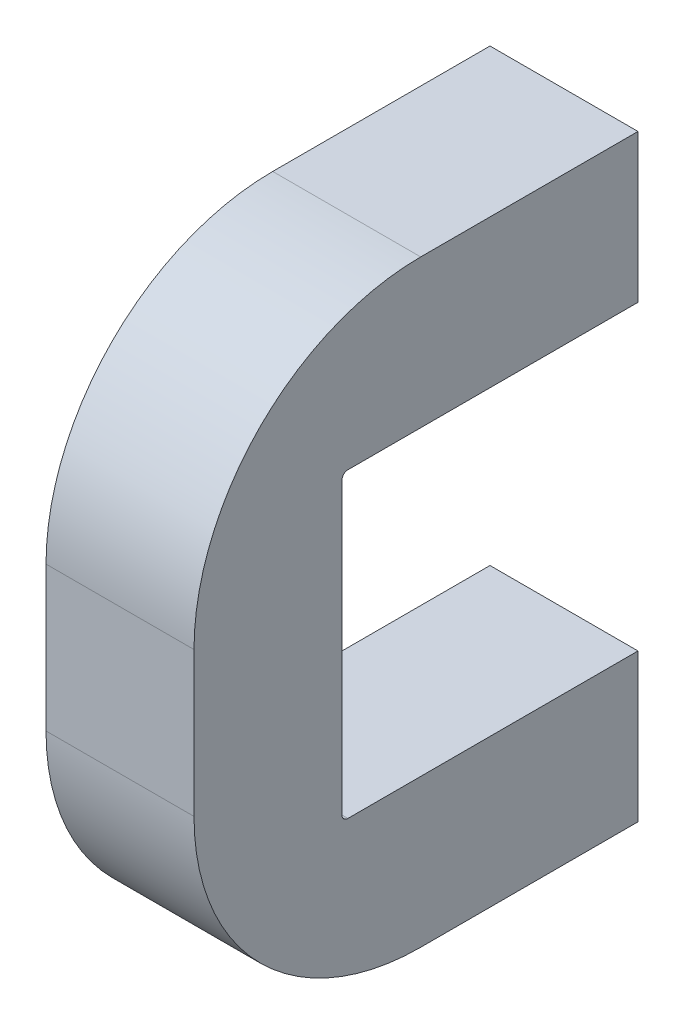
ISO-10303-21;
HEADER;
FILE_DESCRIPTION(('STEP AP214'),'2;1');
FILE_NAME('part.step','',(''),(''),'','','');
FILE_SCHEMA(('AUTOMOTIVE_DESIGN { 1 0 10303 214 1 1 1 1 }'));
ENDSEC;
DATA;
#1=APPLICATION_CONTEXT('core data for automotive mechanical design processes');
#2=APPLICATION_PROTOCOL_DEFINITION('international standard','automotive_design',2000,#1);
#3=PRODUCT_CONTEXT('',#1,'mechanical');
#4=PRODUCT('Part','Part','',(#3));
#5=PRODUCT_RELATED_PRODUCT_CATEGORY('part','',(#4));
#6=PRODUCT_DEFINITION_FORMATION('','',#4);
#7=PRODUCT_DEFINITION_CONTEXT('part definition',#1,'design');
#8=PRODUCT_DEFINITION('design','',#6,#7);
#9=PRODUCT_DEFINITION_SHAPE('','',#8);
#10=(LENGTH_UNIT() NAMED_UNIT(*) SI_UNIT(.MILLI.,.METRE.));
#11=(NAMED_UNIT(*) PLANE_ANGLE_UNIT() SI_UNIT($,.RADIAN.));
#12=(NAMED_UNIT(*) SI_UNIT($,.STERADIAN.) SOLID_ANGLE_UNIT());
#13=UNCERTAINTY_MEASURE_WITH_UNIT(LENGTH_MEASURE(1.E-05),#10,'distance_accuracy_value','');
#14=(GEOMETRIC_REPRESENTATION_CONTEXT(3) GLOBAL_UNCERTAINTY_ASSIGNED_CONTEXT((#13)) GLOBAL_UNIT_ASSIGNED_CONTEXT((#10,
#11,#12)) REPRESENTATION_CONTEXT('',''));
#15=CARTESIAN_POINT('',(0.,0.,0.));
#16=DIRECTION('',(0.,0.,1.));
#17=DIRECTION('',(1.,0.,0.));
#18=AXIS2_PLACEMENT_3D('',#15,#16,#17);
#19=CARTESIAN_POINT('',(7.47463987678536,0.,-95.6657569939596));
#20=DIRECTION('',(0.,0.,-1.));
#21=DIRECTION('',(-1.,0.,0.));
#22=AXIS2_PLACEMENT_3D('',#19,#20,#21);
#23=PLANE('',#22);
#24=DIRECTION('',(0.,-1.,0.));
#25=VECTOR('',#24,1.);
#26=CARTESIAN_POINT('',(-2.52536012321464,0.,-95.6657569939596));
#27=LINE('',#26,#25);
#28=CARTESIAN_POINT('',(-2.52536012321464,170.453924473794,-95.6657569939596));
#29=VERTEX_POINT('',#28);
#30=CARTESIAN_POINT('',(-2.52536012321464,160.688239048845,-95.6657569939596));
#31=VERTEX_POINT('',#30);
#32=EDGE_CURVE('E236',#29,#31,#27,.T.);
#33=ORIENTED_EDGE('',*,*,#32,.T.);
#34=DIRECTION('',(-1.,0.,0.));
#35=VECTOR('',#34,1.);
#36=CARTESIAN_POINT('',(7.47463987678536,160.688239048845,-95.6657569939596));
#37=LINE('',#36,#35);
#38=CARTESIAN_POINT('',(7.47463987678536,160.688239048845,-95.6657569939596));
#39=VERTEX_POINT('',#38);
#40=EDGE_CURVE('E216',#39,#31,#37,.T.);
#41=ORIENTED_EDGE('',*,*,#40,.F.);
#42=DIRECTION('',(0.,-1.,0.));
#43=VECTOR('',#42,1.);
#44=CARTESIAN_POINT('',(7.47463987678536,0.,-95.6657569939596));
#45=LINE('',#44,#43);
#46=CARTESIAN_POINT('',(7.47463987678536,170.453924473794,-95.6657569939596));
#47=VERTEX_POINT('',#46);
#48=EDGE_CURVE('E223',#47,#39,#45,.T.);
#49=ORIENTED_EDGE('',*,*,#48,.F.);
#50=DIRECTION('',(-1.,0.,0.));
#51=VECTOR('',#50,1.);
#52=CARTESIAN_POINT('',(7.47463987678536,170.453924473794,-95.6657569939596));
#53=LINE('',#52,#51);
#54=EDGE_CURVE('E368',#47,#29,#53,.T.);
#55=ORIENTED_EDGE('',*,*,#54,.T.);
#56=EDGE_LOOP('',(#33,#41,#49,#55));
#57=FACE_BOUND('',#56,.T.);
#58=ADVANCED_FACE('F75',(#57),#23,.F.);
#59=CARTESIAN_POINT('',(7.47463987678536,160.688239048845,-110.982914281485));
#60=DIRECTION('',(-1.,0.,0.));
#61=DIRECTION('',(0.,0.,1.));
#62=AXIS2_PLACEMENT_3D('',#59,#60,#61);
#63=CYLINDRICAL_SURFACE('',#62,15.3171572875254);
#64=CARTESIAN_POINT('',(-2.52536012321464,160.688239048845,-110.982914281485));
#65=DIRECTION('',(1.,0.,0.));
#66=DIRECTION('',(0.,0.,-1.));
#67=AXIS2_PLACEMENT_3D('',#64,#65,#66);
#68=CIRCLE('',#67,15.3171572875254);
#69=CARTESIAN_POINT('',(-2.52536012321464,145.37108176132,-110.982914281485));
#70=VERTEX_POINT('',#69);
#71=EDGE_CURVE('E342',#31,#70,#68,.T.);
#72=ORIENTED_EDGE('',*,*,#71,.T.);
#73=DIRECTION('',(-1.,0.,0.));
#74=VECTOR('',#73,1.);
#75=CARTESIAN_POINT('',(7.47463987678536,145.37108176132,-110.982914281485));
#76=LINE('',#75,#74);
#77=CARTESIAN_POINT('',(7.47463987678536,145.37108176132,-110.982914281485));
#78=VERTEX_POINT('',#77);
#79=EDGE_CURVE('E219',#78,#70,#76,.T.);
#80=ORIENTED_EDGE('',*,*,#79,.F.);
#81=CARTESIAN_POINT('',(7.47463987678536,160.688239048845,-110.982914281485));
#82=DIRECTION('',(1.,0.,0.));
#83=DIRECTION('',(0.,0.,-1.));
#84=AXIS2_PLACEMENT_3D('',#81,#82,#83);
#85=CIRCLE('',#84,15.3171572875254);
#86=EDGE_CURVE('E212',#39,#78,#85,.T.);
#87=ORIENTED_EDGE('',*,*,#86,.F.);
#88=ORIENTED_EDGE('',*,*,#40,.T.);
#89=EDGE_LOOP('',(#72,#80,#87,#88));
#90=FACE_BOUND('',#89,.T.);
#91=ADVANCED_FACE('F214',(#90),#63,.T.);
#92=CARTESIAN_POINT('',(7.47463987678536,145.37108176132,0.));
#93=DIRECTION('',(0.,1.,0.));
#94=DIRECTION('',(0.,0.,1.));
#95=AXIS2_PLACEMENT_3D('',#92,#93,#94);
#96=PLANE('',#95);
#97=DIRECTION('',(0.,0.,-1.));
#98=VECTOR('',#97,1.);
#99=CARTESIAN_POINT('',(-2.52536012321464,145.37108176132,0.));
#100=LINE('',#99,#98);
#101=CARTESIAN_POINT('',(-2.52536012321464,145.37108176132,-125.66575699396));
#102=VERTEX_POINT('',#101);
#103=EDGE_CURVE('E371',#70,#102,#100,.T.);
#104=ORIENTED_EDGE('',*,*,#103,.T.);
#105=DIRECTION('',(-1.,0.,0.));
#106=VECTOR('',#105,1.);
#107=CARTESIAN_POINT('',(7.47463987678536,145.37108176132,-125.66575699396));
#108=LINE('',#107,#106);
#109=CARTESIAN_POINT('',(7.47463987678536,145.37108176132,-125.66575699396));
#110=VERTEX_POINT('',#109);
#111=EDGE_CURVE('E242',#110,#102,#108,.T.);
#112=ORIENTED_EDGE('',*,*,#111,.F.);
#113=DIRECTION('',(0.,0.,-1.));
#114=VECTOR('',#113,1.);
#115=CARTESIAN_POINT('',(7.47463987678536,145.37108176132,0.));
#116=LINE('',#115,#114);
#117=EDGE_CURVE('E222',#78,#110,#116,.T.);
#118=ORIENTED_EDGE('',*,*,#117,.F.);
#119=ORIENTED_EDGE('',*,*,#79,.T.);
#120=EDGE_LOOP('',(#104,#112,#118,#119));
#121=FACE_BOUND('',#120,.T.);
#122=ADVANCED_FACE('F314',(#121),#96,.F.);
#123=CARTESIAN_POINT('',(7.47463987678536,0.,-125.66575699396));
#124=DIRECTION('',(0.,0.,-1.));
#125=DIRECTION('',(-1.,0.,0.));
#126=AXIS2_PLACEMENT_3D('',#123,#124,#125);
#127=PLANE('',#126);
#128=CARTESIAN_POINT('',(5.57463987678536,150.37108176132,-125.66575699396));
#129=DIRECTION('',(0.,0.,-1.));
#130=DIRECTION('',(-1.,0.,0.));
#131=AXIS2_PLACEMENT_3D('',#128,#129,#130);
#132=CIRCLE('',#131,1.25);
#133=CARTESIAN_POINT('',(5.86697858646277,151.586416315599,-125.66575699396));
#134=VERTEX_POINT('',#133);
#135=CARTESIAN_POINT('',(5.86697858646277,149.155747207041,-125.66575699396));
#136=VERTEX_POINT('',#135);
#137=EDGE_CURVE('E248',#134,#136,#132,.T.);
#138=ORIENTED_EDGE('',*,*,#137,.F.);
#139=CARTESIAN_POINT('',(6.21778503807566,153.044817780733,-125.66575699396));
#140=DIRECTION('',(0.,0.,-1.));
#141=DIRECTION('',(-1.,0.,0.));
#142=AXIS2_PLACEMENT_3D('',#139,#140,#141);
#143=CIRCLE('',#142,1.5);
#144=CARTESIAN_POINT('',(4.99719422461143,152.17294733962,-125.66575699396));
#145=VERTEX_POINT('',#144);
#146=EDGE_CURVE('E274',#134,#145,#143,.T.);
#147=ORIENTED_EDGE('',*,*,#146,.T.);
#148=CARTESIAN_POINT('',(2.47463987678536,150.37108176132,-125.66575699396));
#149=DIRECTION('',(0.,0.,-1.));
#150=DIRECTION('',(-1.,0.,0.));
#151=AXIS2_PLACEMENT_3D('',#148,#149,#150);
#152=CIRCLE('',#151,3.09999999999999);
#153=CARTESIAN_POINT('',(4.99719422461143,148.569216183019,-125.66575699396));
#154=VERTEX_POINT('',#153);
#155=EDGE_CURVE('E251',#154,#145,#152,.T.);
#156=ORIENTED_EDGE('',*,*,#155,.F.);
#157=CARTESIAN_POINT('',(6.21778503807566,147.697345741906,-125.66575699396));
#158=DIRECTION('',(0.,0.,-1.));
#159=DIRECTION('',(-1.,0.,0.));
#160=AXIS2_PLACEMENT_3D('',#157,#158,#159);
#161=CIRCLE('',#160,1.5);
#162=EDGE_CURVE('E272',#154,#136,#161,.T.);
#163=ORIENTED_EDGE('',*,*,#162,.T.);
#164=EDGE_LOOP('',(#138,#147,#156,#163));
#165=FACE_BOUND('',#164,.T.);
#166=DIRECTION('',(0.,-1.,0.));
#167=VECTOR('',#166,1.);
#168=CARTESIAN_POINT('',(-2.52536012321464,0.,-125.66575699396));
#169=LINE('',#168,#167);
#170=CARTESIAN_POINT('',(-2.52536012321464,155.37108176132,-125.66575699396));
#171=VERTEX_POINT('',#170);
#172=EDGE_CURVE('E374',#171,#102,#169,.T.);
#173=ORIENTED_EDGE('',*,*,#172,.F.);
#174=DIRECTION('',(-1.,0.,0.));
#175=VECTOR('',#174,1.);
#176=CARTESIAN_POINT('',(7.47463987678536,155.37108176132,-125.66575699396));
#177=LINE('',#176,#175);
#178=CARTESIAN_POINT('',(7.47463987678536,155.37108176132,-125.66575699396));
#179=VERTEX_POINT('',#178);
#180=EDGE_CURVE('E414',#179,#171,#177,.T.);
#181=ORIENTED_EDGE('',*,*,#180,.F.);
#182=DIRECTION('',(0.,-1.,0.));
#183=VECTOR('',#182,1.);
#184=CARTESIAN_POINT('',(7.47463987678536,0.,-125.66575699396));
#185=LINE('',#184,#183);
#186=EDGE_CURVE('E348',#179,#110,#185,.T.);
#187=ORIENTED_EDGE('',*,*,#186,.T.);
#188=ORIENTED_EDGE('',*,*,#111,.T.);
#189=EDGE_LOOP('',(#173,#181,#187,#188));
#190=FACE_BOUND('',#189,.T.);
#191=ADVANCED_FACE('F299',(#165,#190),#127,.T.);
#192=CARTESIAN_POINT('',(7.47463987678536,155.37108176132,0.));
#193=DIRECTION('',(0.,-1.,0.));
#194=DIRECTION('',(0.,0.,-1.));
#195=AXIS2_PLACEMENT_3D('',#192,#193,#194);
#196=PLANE('',#195);
#197=DIRECTION('',(0.,0.,1.));
#198=VECTOR('',#197,1.);
#199=CARTESIAN_POINT('',(-2.52536012321464,155.37108176132,0.));
#200=LINE('',#199,#198);
#201=CARTESIAN_POINT('',(-2.52536012321464,155.37108176132,-106.06575699396));
#202=VERTEX_POINT('',#201);
#203=EDGE_CURVE('E377',#171,#202,#200,.T.);
#204=ORIENTED_EDGE('',*,*,#203,.T.);
#205=DIRECTION('',(-1.,0.,0.));
#206=VECTOR('',#205,1.);
#207=CARTESIAN_POINT('',(7.47463987678536,155.37108176132,-106.06575699396));
#208=LINE('',#207,#206);
#209=CARTESIAN_POINT('',(7.47463987678536,155.37108176132,-106.06575699396));
#210=VERTEX_POINT('',#209);
#211=EDGE_CURVE('E412',#210,#202,#208,.T.);
#212=ORIENTED_EDGE('',*,*,#211,.F.);
#213=DIRECTION('',(0.,0.,1.));
#214=VECTOR('',#213,1.);
#215=CARTESIAN_POINT('',(7.47463987678536,155.37108176132,0.));
#216=LINE('',#215,#214);
#217=EDGE_CURVE('E351',#179,#210,#216,.T.);
#218=ORIENTED_EDGE('',*,*,#217,.F.);
#219=ORIENTED_EDGE('',*,*,#180,.T.);
#220=EDGE_LOOP('',(#204,#212,#218,#219));
#221=FACE_BOUND('',#220,.T.);
#222=ADVANCED_FACE('F427',(#221),#196,.F.);
#223=CARTESIAN_POINT('',(7.47463987678536,155.77108176132,-106.06575699396));
#224=DIRECTION('',(-1.,0.,0.));
#225=DIRECTION('',(0.,0.,1.));
#226=AXIS2_PLACEMENT_3D('',#223,#224,#225);
#227=CYLINDRICAL_SURFACE('',#226,0.399999999999998);
#228=CARTESIAN_POINT('',(-2.52536012321464,155.77108176132,-106.06575699396));
#229=DIRECTION('',(1.,0.,0.));
#230=DIRECTION('',(0.,0.,-1.));
#231=AXIS2_PLACEMENT_3D('',#228,#229,#230);
#232=CIRCLE('',#231,0.399999999999998);
#233=CARTESIAN_POINT('',(-2.52536012321464,155.77108176132,-105.66575699396));
#234=VERTEX_POINT('',#233);
#235=EDGE_CURVE('E380',#234,#202,#232,.T.);
#236=ORIENTED_EDGE('',*,*,#235,.F.);
#237=DIRECTION('',(-1.,0.,0.));
#238=VECTOR('',#237,1.);
#239=CARTESIAN_POINT('',(7.47463987678536,155.77108176132,-105.66575699396));
#240=LINE('',#239,#238);
#241=CARTESIAN_POINT('',(7.47463987678536,155.77108176132,-105.66575699396));
#242=VERTEX_POINT('',#241);
#243=EDGE_CURVE('E410',#242,#234,#240,.T.);
#244=ORIENTED_EDGE('',*,*,#243,.F.);
#245=CARTESIAN_POINT('',(7.47463987678536,155.77108176132,-106.06575699396));
#246=DIRECTION('',(1.,0.,0.));
#247=DIRECTION('',(0.,0.,-1.));
#248=AXIS2_PLACEMENT_3D('',#245,#246,#247);
#249=CIRCLE('',#248,0.399999999999998);
#250=EDGE_CURVE('E353',#242,#210,#249,.T.);
#251=ORIENTED_EDGE('',*,*,#250,.T.);
#252=ORIENTED_EDGE('',*,*,#211,.T.);
#253=EDGE_LOOP('',(#236,#244,#251,#252));
#254=FACE_BOUND('',#253,.T.);
#255=ADVANCED_FACE('F434',(#254),#227,.F.);
#256=CARTESIAN_POINT('',(7.47463987678536,2.98222503037371E-13,-105.66575699396));
#257=DIRECTION('',(0.,0.,1.));
#258=DIRECTION('',(0.,-1.,0.));
#259=AXIS2_PLACEMENT_3D('',#256,#257,#258);
#260=PLANE('',#259);
#261=DIRECTION('',(0.,1.,0.));
#262=VECTOR('',#261,1.);
#263=CARTESIAN_POINT('',(-2.52536012321464,2.98222503037371E-13,-105.66575699396));
#264=LINE('',#263,#262);
#265=CARTESIAN_POINT('',(-2.52536012321464,175.37108176132,-105.66575699396));
#266=VERTEX_POINT('',#265);
#267=EDGE_CURVE('E383',#234,#266,#264,.T.);
#268=ORIENTED_EDGE('',*,*,#267,.T.);
#269=DIRECTION('',(-1.,0.,0.));
#270=VECTOR('',#269,1.);
#271=CARTESIAN_POINT('',(7.47463987678536,175.37108176132,-105.66575699396));
#272=LINE('',#271,#270);
#273=CARTESIAN_POINT('',(7.47463987678536,175.37108176132,-105.66575699396));
#274=VERTEX_POINT('',#273);
#275=EDGE_CURVE('E408',#274,#266,#272,.T.);
#276=ORIENTED_EDGE('',*,*,#275,.F.);
#277=DIRECTION('',(0.,1.,0.));
#278=VECTOR('',#277,1.);
#279=CARTESIAN_POINT('',(7.47463987678536,2.98222503037371E-13,-105.66575699396));
#280=LINE('',#279,#278);
#281=EDGE_CURVE('E356',#242,#274,#280,.T.);
#282=ORIENTED_EDGE('',*,*,#281,.F.);
#283=ORIENTED_EDGE('',*,*,#243,.T.);
#284=EDGE_LOOP('',(#268,#276,#282,#283));
#285=FACE_BOUND('',#284,.T.);
#286=ADVANCED_FACE('F436',(#285),#260,.F.);
#287=CARTESIAN_POINT('',(7.47463987678536,175.37108176132,-106.06575699396));
#288=DIRECTION('',(-1.,0.,0.));
#289=DIRECTION('',(0.,0.,1.));
#290=AXIS2_PLACEMENT_3D('',#287,#288,#289);
#291=CYLINDRICAL_SURFACE('',#290,0.400000000000005);
#292=CARTESIAN_POINT('',(-2.52536012321464,175.37108176132,-106.06575699396));
#293=DIRECTION('',(1.,0.,0.));
#294=DIRECTION('',(0.,0.,-1.));
#295=AXIS2_PLACEMENT_3D('',#292,#293,#294);
#296=CIRCLE('',#295,0.400000000000005);
#297=CARTESIAN_POINT('',(-2.52536012321464,175.77108176132,-106.06575699396));
#298=VERTEX_POINT('',#297);
#299=EDGE_CURVE('E386',#298,#266,#296,.T.);
#300=ORIENTED_EDGE('',*,*,#299,.F.);
#301=DIRECTION('',(-1.,0.,0.));
#302=VECTOR('',#301,1.);
#303=CARTESIAN_POINT('',(7.47463987678536,175.77108176132,-106.06575699396));
#304=LINE('',#303,#302);
#305=CARTESIAN_POINT('',(7.47463987678536,175.77108176132,-106.06575699396));
#306=VERTEX_POINT('',#305);
#307=EDGE_CURVE('E406',#306,#298,#304,.T.);
#308=ORIENTED_EDGE('',*,*,#307,.F.);
#309=CARTESIAN_POINT('',(7.47463987678536,175.37108176132,-106.06575699396));
#310=DIRECTION('',(1.,0.,0.));
#311=DIRECTION('',(0.,0.,-1.));
#312=AXIS2_PLACEMENT_3D('',#309,#310,#311);
#313=CIRCLE('',#312,0.400000000000005);
#314=EDGE_CURVE('E358',#306,#274,#313,.T.);
#315=ORIENTED_EDGE('',*,*,#314,.T.);
#316=ORIENTED_EDGE('',*,*,#275,.T.);
#317=EDGE_LOOP('',(#300,#308,#315,#316));
#318=FACE_BOUND('',#317,.T.);
#319=ADVANCED_FACE('F439',(#318),#291,.F.);
#320=CARTESIAN_POINT('',(7.47463987678536,175.771081761321,-1.98432845060461E-12));
#321=DIRECTION('',(0.,1.,0.));
#322=DIRECTION('',(0.,0.,1.));
#323=AXIS2_PLACEMENT_3D('',#320,#321,#322);
#324=PLANE('',#323);
#325=DIRECTION('',(0.,0.,-1.));
#326=VECTOR('',#325,1.);
#327=CARTESIAN_POINT('',(-2.52536012321464,175.771081761321,-1.98432845060461E-12));
#328=LINE('',#327,#326);
#329=CARTESIAN_POINT('',(-2.52536012321464,175.77108176132,-125.66575699396));
#330=VERTEX_POINT('',#329);
#331=EDGE_CURVE('E389',#298,#330,#328,.T.);
#332=ORIENTED_EDGE('',*,*,#331,.T.);
#333=DIRECTION('',(-1.,0.,0.));
#334=VECTOR('',#333,1.);
#335=CARTESIAN_POINT('',(7.47463987678536,175.77108176132,-125.66575699396));
#336=LINE('',#335,#334);
#337=CARTESIAN_POINT('',(7.47463987678536,175.77108176132,-125.66575699396));
#338=VERTEX_POINT('',#337);
#339=EDGE_CURVE('E403',#338,#330,#336,.T.);
#340=ORIENTED_EDGE('',*,*,#339,.F.);
#341=DIRECTION('',(0.,0.,-1.));
#342=VECTOR('',#341,1.);
#343=CARTESIAN_POINT('',(7.47463987678536,175.771081761321,-1.98432845060461E-12));
#344=LINE('',#343,#342);
#345=EDGE_CURVE('E361',#306,#338,#344,.T.);
#346=ORIENTED_EDGE('',*,*,#345,.F.);
#347=ORIENTED_EDGE('',*,*,#307,.T.);
#348=EDGE_LOOP('',(#332,#340,#346,#347));
#349=FACE_BOUND('',#348,.T.);
#350=ADVANCED_FACE('F445',(#349),#324,.F.);
#351=CARTESIAN_POINT('',(7.47463987678536,0.,-125.66575699396));
#352=DIRECTION('',(0.,0.,1.));
#353=DIRECTION('',(1.,0.,0.));
#354=AXIS2_PLACEMENT_3D('',#351,#352,#353);
#355=PLANE('',#354);
#356=CARTESIAN_POINT('',(5.57463987678536,180.77108176132,-125.66575699396));
#357=DIRECTION('',(0.,0.,1.));
#358=DIRECTION('',(1.,0.,0.));
#359=AXIS2_PLACEMENT_3D('',#356,#357,#358);
#360=CIRCLE('',#359,1.25);
#361=CARTESIAN_POINT('',(5.86697858646277,179.555747207041,-125.66575699396));
#362=VERTEX_POINT('',#361);
#363=CARTESIAN_POINT('',(5.86697858646277,181.986416315599,-125.66575699396));
#364=VERTEX_POINT('',#363);
#365=EDGE_CURVE('E240',#362,#364,#360,.T.);
#366=ORIENTED_EDGE('',*,*,#365,.T.);
#367=CARTESIAN_POINT('',(6.21778503807566,183.444817780733,-125.66575699396));
#368=DIRECTION('',(0.,0.,1.));
#369=DIRECTION('',(1.,0.,0.));
#370=AXIS2_PLACEMENT_3D('',#367,#368,#369);
#371=CIRCLE('',#370,1.5);
#372=CARTESIAN_POINT('',(4.99719422461142,182.57294733962,-125.66575699396));
#373=VERTEX_POINT('',#372);
#374=EDGE_CURVE('E260',#364,#373,#371,.F.);
#375=ORIENTED_EDGE('',*,*,#374,.T.);
#376=CARTESIAN_POINT('',(2.47463987678536,180.77108176132,-125.66575699396));
#377=DIRECTION('',(0.,0.,1.));
#378=DIRECTION('',(1.,0.,0.));
#379=AXIS2_PLACEMENT_3D('',#376,#377,#378);
#380=CIRCLE('',#379,3.09999999999998);
#381=CARTESIAN_POINT('',(4.99719422461142,178.969216183019,-125.66575699396));
#382=VERTEX_POINT('',#381);
#383=EDGE_CURVE('E237',#373,#382,#380,.T.);
#384=ORIENTED_EDGE('',*,*,#383,.T.);
#385=CARTESIAN_POINT('',(6.21778503807566,178.097345741906,-125.66575699396));
#386=DIRECTION('',(0.,0.,1.));
#387=DIRECTION('',(1.,0.,0.));
#388=AXIS2_PLACEMENT_3D('',#385,#386,#387);
#389=CIRCLE('',#388,1.5);
#390=EDGE_CURVE('E258',#382,#362,#389,.F.);
#391=ORIENTED_EDGE('',*,*,#390,.T.);
#392=EDGE_LOOP('',(#366,#375,#384,#391));
#393=FACE_BOUND('',#392,.T.);
#394=DIRECTION('',(0.,1.,0.));
#395=VECTOR('',#394,1.);
#396=CARTESIAN_POINT('',(-2.52536012321464,0.,-125.66575699396));
#397=LINE('',#396,#395);
#398=CARTESIAN_POINT('',(-2.52536012321464,185.77108176132,-125.66575699396));
#399=VERTEX_POINT('',#398);
#400=EDGE_CURVE('E391',#330,#399,#397,.T.);
#401=ORIENTED_EDGE('',*,*,#400,.T.);
#402=DIRECTION('',(-1.,0.,0.));
#403=VECTOR('',#402,1.);
#404=CARTESIAN_POINT('',(7.47463987678536,185.77108176132,-125.66575699396));
#405=LINE('',#404,#403);
#406=CARTESIAN_POINT('',(7.47463987678536,185.77108176132,-125.66575699396));
#407=VERTEX_POINT('',#406);
#408=EDGE_CURVE('E401',#407,#399,#405,.T.);
#409=ORIENTED_EDGE('',*,*,#408,.F.);
#410=DIRECTION('',(0.,1.,0.));
#411=VECTOR('',#410,1.);
#412=CARTESIAN_POINT('',(7.47463987678536,0.,-125.66575699396));
#413=LINE('',#412,#411);
#414=EDGE_CURVE('E363',#338,#407,#413,.T.);
#415=ORIENTED_EDGE('',*,*,#414,.F.);
#416=ORIENTED_EDGE('',*,*,#339,.T.);
#417=EDGE_LOOP('',(#401,#409,#415,#416));
#418=FACE_BOUND('',#417,.T.);
#419=ADVANCED_FACE('F449',(#393,#418),#355,.F.);
#420=CARTESIAN_POINT('',(7.47463987678536,185.77108176132,0.));
#421=DIRECTION('',(0.,1.,0.));
#422=DIRECTION('',(0.,0.,1.));
#423=AXIS2_PLACEMENT_3D('',#420,#421,#422);
#424=PLANE('',#423);
#425=DIRECTION('',(0.,0.,-1.));
#426=VECTOR('',#425,1.);
#427=CARTESIAN_POINT('',(-2.52536012321464,185.77108176132,0.));
#428=LINE('',#427,#426);
#429=CARTESIAN_POINT('',(-2.52536012321464,185.77108176132,-110.982914281485));
#430=VERTEX_POINT('',#429);
#431=EDGE_CURVE('E394',#430,#399,#428,.T.);
#432=ORIENTED_EDGE('',*,*,#431,.F.);
#433=DIRECTION('',(-1.,0.,0.));
#434=VECTOR('',#433,1.);
#435=CARTESIAN_POINT('',(7.47463987678536,185.77108176132,-110.982914281485));
#436=LINE('',#435,#434);
#437=CARTESIAN_POINT('',(7.47463987678536,185.77108176132,-110.982914281485));
#438=VERTEX_POINT('',#437);
#439=EDGE_CURVE('E399',#438,#430,#436,.T.);
#440=ORIENTED_EDGE('',*,*,#439,.F.);
#441=DIRECTION('',(0.,0.,-1.));
#442=VECTOR('',#441,1.);
#443=CARTESIAN_POINT('',(7.47463987678536,185.77108176132,0.));
#444=LINE('',#443,#442);
#445=EDGE_CURVE('E365',#438,#407,#444,.T.);
#446=ORIENTED_EDGE('',*,*,#445,.T.);
#447=ORIENTED_EDGE('',*,*,#408,.T.);
#448=EDGE_LOOP('',(#432,#440,#446,#447));
#449=FACE_BOUND('',#448,.T.);
#450=ADVANCED_FACE('F452',(#449),#424,.T.);
#451=CARTESIAN_POINT('',(7.47463987678536,170.453924473794,-110.982914281485));
#452=DIRECTION('',(-1.,0.,0.));
#453=DIRECTION('',(0.,0.,1.));
#454=AXIS2_PLACEMENT_3D('',#451,#452,#453);
#455=CYLINDRICAL_SURFACE('',#454,15.3171572875254);
#456=CARTESIAN_POINT('',(-2.52536012321464,170.453924473794,-110.982914281485));
#457=DIRECTION('',(1.,0.,0.));
#458=DIRECTION('',(0.,0.,-1.));
#459=AXIS2_PLACEMENT_3D('',#456,#457,#458);
#460=CIRCLE('',#459,15.3171572875254);
#461=EDGE_CURVE('E233',#430,#29,#460,.T.);
#462=ORIENTED_EDGE('',*,*,#461,.T.);
#463=ORIENTED_EDGE('',*,*,#54,.F.);
#464=CARTESIAN_POINT('',(7.47463987678536,170.453924473794,-110.982914281485));
#465=DIRECTION('',(1.,0.,0.));
#466=DIRECTION('',(0.,0.,-1.));
#467=AXIS2_PLACEMENT_3D('',#464,#465,#466);
#468=CIRCLE('',#467,15.3171572875254);
#469=EDGE_CURVE('E229',#438,#47,#468,.T.);
#470=ORIENTED_EDGE('',*,*,#469,.F.);
#471=ORIENTED_EDGE('',*,*,#439,.T.);
#472=EDGE_LOOP('',(#462,#463,#470,#471));
#473=FACE_BOUND('',#472,.T.);
#474=ADVANCED_FACE('F455',(#473),#455,.T.);
#475=CARTESIAN_POINT('',(7.47463987678536,0.,0.));
#476=DIRECTION('',(1.,0.,0.));
#477=DIRECTION('',(0.,0.,-1.));
#478=AXIS2_PLACEMENT_3D('',#475,#476,#477);
#479=PLANE('',#478);
#480=ORIENTED_EDGE('',*,*,#48,.T.);
#481=ORIENTED_EDGE('',*,*,#86,.T.);
#482=ORIENTED_EDGE('',*,*,#117,.T.);
#483=ORIENTED_EDGE('',*,*,#186,.F.);
#484=ORIENTED_EDGE('',*,*,#217,.T.);
#485=ORIENTED_EDGE('',*,*,#250,.F.);
#486=ORIENTED_EDGE('',*,*,#281,.T.);
#487=ORIENTED_EDGE('',*,*,#314,.F.);
#488=ORIENTED_EDGE('',*,*,#345,.T.);
#489=ORIENTED_EDGE('',*,*,#414,.T.);
#490=ORIENTED_EDGE('',*,*,#445,.F.);
#491=ORIENTED_EDGE('',*,*,#469,.T.);
#492=EDGE_LOOP('',(#480,#481,#482,#483,#484,#485,#486,#487,#488,#489,#490,#491));
#493=FACE_BOUND('',#492,.T.);
#494=ADVANCED_FACE('F226',(#493),#479,.T.);
#495=CARTESIAN_POINT('',(-2.52536012321464,0.,0.));
#496=DIRECTION('',(1.,0.,0.));
#497=DIRECTION('',(0.,0.,-1.));
#498=AXIS2_PLACEMENT_3D('',#495,#496,#497);
#499=PLANE('',#498);
#500=ORIENTED_EDGE('',*,*,#32,.F.);
#501=ORIENTED_EDGE('',*,*,#461,.F.);
#502=ORIENTED_EDGE('',*,*,#431,.T.);
#503=ORIENTED_EDGE('',*,*,#400,.F.);
#504=ORIENTED_EDGE('',*,*,#331,.F.);
#505=ORIENTED_EDGE('',*,*,#299,.T.);
#506=ORIENTED_EDGE('',*,*,#267,.F.);
#507=ORIENTED_EDGE('',*,*,#235,.T.);
#508=ORIENTED_EDGE('',*,*,#203,.F.);
#509=ORIENTED_EDGE('',*,*,#172,.T.);
#510=ORIENTED_EDGE('',*,*,#103,.F.);
#511=ORIENTED_EDGE('',*,*,#71,.F.);
#512=EDGE_LOOP('',(#500,#501,#502,#503,#504,#505,#506,#507,#508,#509,#510,#511));
#513=FACE_BOUND('',#512,.T.);
#514=ADVANCED_FACE('F422',(#513),#499,.F.);
#515=CARTESIAN_POINT('',(5.57463987678536,180.77108176132,-122.86575699396));
#516=DIRECTION('',(0.,0.,-1.));
#517=DIRECTION('',(-1.,0.,0.));
#518=AXIS2_PLACEMENT_3D('',#515,#516,#517);
#519=CYLINDRICAL_SURFACE('',#518,1.25);
#520=CARTESIAN_POINT('',(5.57463987678536,180.77108176132,-122.86575699396));
#521=DIRECTION('',(0.,0.,-1.));
#522=DIRECTION('',(-1.,0.,0.));
#523=AXIS2_PLACEMENT_3D('',#520,#521,#522);
#524=CIRCLE('',#523,1.25);
#525=CARTESIAN_POINT('',(5.86697858646277,181.986416315599,-122.86575699396));
#526=VERTEX_POINT('',#525);
#527=CARTESIAN_POINT('',(5.86697858646277,179.555747207041,-122.86575699396));
#528=VERTEX_POINT('',#527);
#529=EDGE_CURVE('E294',#526,#528,#524,.T.);
#530=ORIENTED_EDGE('',*,*,#529,.F.);
#531=DIRECTION('',(0.,0.,-1.));
#532=VECTOR('',#531,1.);
#533=CARTESIAN_POINT('',(5.86697858646277,181.986416315599,-122.86575699396));
#534=LINE('',#533,#532);
#535=EDGE_CURVE('E255',#526,#364,#534,.T.);
#536=ORIENTED_EDGE('',*,*,#535,.T.);
#537=ORIENTED_EDGE('',*,*,#365,.F.);
#538=DIRECTION('',(0.,0.,-1.));
#539=VECTOR('',#538,1.);
#540=CARTESIAN_POINT('',(5.86697858646277,179.555747207041,-122.86575699396));
#541=LINE('',#540,#539);
#542=EDGE_CURVE('E253',#362,#528,#541,.F.);
#543=ORIENTED_EDGE('',*,*,#542,.T.);
#544=EDGE_LOOP('',(#530,#536,#537,#543));
#545=FACE_BOUND('',#544,.T.);
#546=ADVANCED_FACE('F541',(#545),#519,.F.);
#547=CARTESIAN_POINT('',(2.47463987678536,180.77108176132,-122.86575699396));
#548=DIRECTION('',(0.,0.,-1.));
#549=DIRECTION('',(-1.,0.,0.));
#550=AXIS2_PLACEMENT_3D('',#547,#548,#549);
#551=CYLINDRICAL_SURFACE('',#550,3.09999999999998);
#552=ORIENTED_EDGE('',*,*,#383,.F.);
#553=DIRECTION('',(0.,0.,-1.));
#554=VECTOR('',#553,1.);
#555=CARTESIAN_POINT('',(4.99719422461142,182.57294733962,-122.86575699396));
#556=LINE('',#555,#554);
#557=CARTESIAN_POINT('',(4.99719422461142,182.57294733962,-122.86575699396));
#558=VERTEX_POINT('',#557);
#559=EDGE_CURVE('E265',#373,#558,#556,.F.);
#560=ORIENTED_EDGE('',*,*,#559,.T.);
#561=CARTESIAN_POINT('',(2.47463987678536,180.77108176132,-122.86575699396));
#562=DIRECTION('',(0.,0.,-1.));
#563=DIRECTION('',(-1.,0.,0.));
#564=AXIS2_PLACEMENT_3D('',#561,#562,#563);
#565=CIRCLE('',#564,3.09999999999998);
#566=CARTESIAN_POINT('',(4.99719422461142,178.969216183019,-122.86575699396));
#567=VERTEX_POINT('',#566);
#568=EDGE_CURVE('E334',#567,#558,#565,.T.);
#569=ORIENTED_EDGE('',*,*,#568,.F.);
#570=DIRECTION('',(0.,0.,-1.));
#571=VECTOR('',#570,1.);
#572=CARTESIAN_POINT('',(4.99719422461142,178.969216183019,-122.86575699396));
#573=LINE('',#572,#571);
#574=EDGE_CURVE('E262',#567,#382,#573,.T.);
#575=ORIENTED_EDGE('',*,*,#574,.T.);
#576=EDGE_LOOP('',(#552,#560,#569,#575));
#577=FACE_BOUND('',#576,.T.);
#578=ADVANCED_FACE('F339',(#577),#551,.F.);
#579=CARTESIAN_POINT('',(0.,0.,-122.86575699396));
#580=DIRECTION('',(0.,0.,-1.));
#581=DIRECTION('',(-1.,0.,0.));
#582=AXIS2_PLACEMENT_3D('',#579,#580,#581);
#583=PLANE('',#582);
#584=ORIENTED_EDGE('',*,*,#568,.T.);
#585=CARTESIAN_POINT('',(6.21778503807566,183.444817780733,-122.86575699396));
#586=DIRECTION('',(0.,0.,-1.));
#587=DIRECTION('',(-1.,0.,0.));
#588=AXIS2_PLACEMENT_3D('',#585,#586,#587);
#589=CIRCLE('',#588,1.5);
#590=EDGE_CURVE('E280',#558,#526,#589,.F.);
#591=ORIENTED_EDGE('',*,*,#590,.T.);
#592=ORIENTED_EDGE('',*,*,#529,.T.);
#593=CARTESIAN_POINT('',(6.21778503807566,178.097345741906,-122.86575699396));
#594=DIRECTION('',(0.,0.,-1.));
#595=DIRECTION('',(-1.,0.,0.));
#596=AXIS2_PLACEMENT_3D('',#593,#594,#595);
#597=CIRCLE('',#596,1.5);
#598=EDGE_CURVE('E282',#528,#567,#597,.F.);
#599=ORIENTED_EDGE('',*,*,#598,.T.);
#600=EDGE_LOOP('',(#584,#591,#592,#599));
#601=FACE_BOUND('',#600,.T.);
#602=ADVANCED_FACE('F333',(#601),#583,.T.);
#603=CARTESIAN_POINT('',(2.47463987678536,150.37108176132,-122.86575699396));
#604=DIRECTION('',(0.,0.,-1.));
#605=DIRECTION('',(-1.,0.,0.));
#606=AXIS2_PLACEMENT_3D('',#603,#604,#605);
#607=CYLINDRICAL_SURFACE('',#606,3.09999999999999);
#608=ORIENTED_EDGE('',*,*,#155,.T.);
#609=DIRECTION('',(0.,0.,-1.));
#610=VECTOR('',#609,1.);
#611=CARTESIAN_POINT('',(4.99719422461143,152.17294733962,-122.86575699396));
#612=LINE('',#611,#610);
#613=CARTESIAN_POINT('',(4.99719422461143,152.17294733962,-122.86575699396));
#614=VERTEX_POINT('',#613);
#615=EDGE_CURVE('E90',#145,#614,#612,.F.);
#616=ORIENTED_EDGE('',*,*,#615,.T.);
#617=CARTESIAN_POINT('',(2.47463987678536,150.37108176132,-122.86575699396));
#618=DIRECTION('',(0.,0.,-1.));
#619=DIRECTION('',(-1.,0.,0.));
#620=AXIS2_PLACEMENT_3D('',#617,#618,#619);
#621=CIRCLE('',#620,3.09999999999999);
#622=CARTESIAN_POINT('',(4.99719422461143,148.569216183019,-122.86575699396));
#623=VERTEX_POINT('',#622);
#624=EDGE_CURVE('E287',#623,#614,#621,.T.);
#625=ORIENTED_EDGE('',*,*,#624,.F.);
#626=DIRECTION('',(0.,0.,-1.));
#627=VECTOR('',#626,1.);
#628=CARTESIAN_POINT('',(4.99719422461143,148.569216183019,-122.86575699396));
#629=LINE('',#628,#627);
#630=EDGE_CURVE('E276',#623,#154,#629,.T.);
#631=ORIENTED_EDGE('',*,*,#630,.T.);
#632=EDGE_LOOP('',(#608,#616,#625,#631));
#633=FACE_BOUND('',#632,.T.);
#634=ADVANCED_FACE('F301',(#633),#607,.F.);
#635=CARTESIAN_POINT('',(0.,0.,-122.86575699396));
#636=DIRECTION('',(0.,0.,-1.));
#637=DIRECTION('',(-1.,0.,0.));
#638=AXIS2_PLACEMENT_3D('',#635,#636,#637);
#639=PLANE('',#638);
#640=CARTESIAN_POINT('',(5.57463987678536,150.37108176132,-122.86575699396));
#641=DIRECTION('',(0.,0.,-1.));
#642=DIRECTION('',(-1.,0.,0.));
#643=AXIS2_PLACEMENT_3D('',#640,#641,#642);
#644=CIRCLE('',#643,1.25);
#645=CARTESIAN_POINT('',(5.86697858646277,151.586416315599,-122.86575699396));
#646=VERTEX_POINT('',#645);
#647=CARTESIAN_POINT('',(5.86697858646277,149.155747207041,-122.86575699396));
#648=VERTEX_POINT('',#647);
#649=EDGE_CURVE('E286',#646,#648,#644,.T.);
#650=ORIENTED_EDGE('',*,*,#649,.T.);
#651=CARTESIAN_POINT('',(6.21778503807566,147.697345741906,-122.86575699396));
#652=DIRECTION('',(0.,0.,-1.));
#653=DIRECTION('',(-1.,0.,0.));
#654=AXIS2_PLACEMENT_3D('',#651,#652,#653);
#655=CIRCLE('',#654,1.5);
#656=EDGE_CURVE('E12',#648,#623,#655,.F.);
#657=ORIENTED_EDGE('',*,*,#656,.T.);
#658=ORIENTED_EDGE('',*,*,#624,.T.);
#659=CARTESIAN_POINT('',(6.21778503807566,153.044817780733,-122.86575699396));
#660=DIRECTION('',(0.,0.,-1.));
#661=DIRECTION('',(-1.,0.,0.));
#662=AXIS2_PLACEMENT_3D('',#659,#660,#661);
#663=CIRCLE('',#662,1.5);
#664=EDGE_CURVE('E83',#614,#646,#663,.F.);
#665=ORIENTED_EDGE('',*,*,#664,.T.);
#666=EDGE_LOOP('',(#650,#657,#658,#665));
#667=FACE_BOUND('',#666,.T.);
#668=ADVANCED_FACE('F285',(#667),#639,.T.);
#669=CARTESIAN_POINT('',(5.57463987678536,150.37108176132,-122.86575699396));
#670=DIRECTION('',(0.,0.,-1.));
#671=DIRECTION('',(-1.,0.,0.));
#672=AXIS2_PLACEMENT_3D('',#669,#670,#671);
#673=CYLINDRICAL_SURFACE('',#672,1.25);
#674=ORIENTED_EDGE('',*,*,#649,.F.);
#675=DIRECTION('',(0.,0.,-1.));
#676=VECTOR('',#675,1.);
#677=CARTESIAN_POINT('',(5.86697858646277,151.586416315599,-122.86575699396));
#678=LINE('',#677,#676);
#679=EDGE_CURVE('E269',#646,#134,#678,.T.);
#680=ORIENTED_EDGE('',*,*,#679,.T.);
#681=ORIENTED_EDGE('',*,*,#137,.T.);
#682=DIRECTION('',(0.,0.,-1.));
#683=VECTOR('',#682,1.);
#684=CARTESIAN_POINT('',(5.86697858646277,149.155747207041,-122.86575699396));
#685=LINE('',#684,#683);
#686=EDGE_CURVE('E267',#136,#648,#685,.F.);
#687=ORIENTED_EDGE('',*,*,#686,.T.);
#688=EDGE_LOOP('',(#674,#680,#681,#687));
#689=FACE_BOUND('',#688,.T.);
#690=ADVANCED_FACE('F291',(#689),#673,.F.);
#691=CARTESIAN_POINT('',(6.21778503807566,183.444817780733,-122.86575699396));
#692=DIRECTION('',(0.,0.,-1.));
#693=DIRECTION('',(-1.,0.,0.));
#694=AXIS2_PLACEMENT_3D('',#691,#692,#693);
#695=CYLINDRICAL_SURFACE('',#694,1.5);
#696=ORIENTED_EDGE('',*,*,#590,.F.);
#697=ORIENTED_EDGE('',*,*,#559,.F.);
#698=ORIENTED_EDGE('',*,*,#374,.F.);
#699=ORIENTED_EDGE('',*,*,#535,.F.);
#700=EDGE_LOOP('',(#696,#697,#698,#699));
#701=FACE_BOUND('',#700,.T.);
#702=ADVANCED_FACE('F318',(#701),#695,.T.);
#703=CARTESIAN_POINT('',(6.21778503807566,178.097345741906,-122.86575699396));
#704=DIRECTION('',(0.,0.,-1.));
#705=DIRECTION('',(-1.,0.,0.));
#706=AXIS2_PLACEMENT_3D('',#703,#704,#705);
#707=CYLINDRICAL_SURFACE('',#706,1.5);
#708=ORIENTED_EDGE('',*,*,#598,.F.);
#709=ORIENTED_EDGE('',*,*,#542,.F.);
#710=ORIENTED_EDGE('',*,*,#390,.F.);
#711=ORIENTED_EDGE('',*,*,#574,.F.);
#712=EDGE_LOOP('',(#708,#709,#710,#711));
#713=FACE_BOUND('',#712,.T.);
#714=ADVANCED_FACE('F308',(#713),#707,.T.);
#715=CARTESIAN_POINT('',(6.21778503807566,153.044817780733,-122.86575699396));
#716=DIRECTION('',(0.,0.,-1.));
#717=DIRECTION('',(-1.,0.,0.));
#718=AXIS2_PLACEMENT_3D('',#715,#716,#717);
#719=CYLINDRICAL_SURFACE('',#718,1.5);
#720=ORIENTED_EDGE('',*,*,#664,.F.);
#721=ORIENTED_EDGE('',*,*,#615,.F.);
#722=ORIENTED_EDGE('',*,*,#146,.F.);
#723=ORIENTED_EDGE('',*,*,#679,.F.);
#724=EDGE_LOOP('',(#720,#721,#722,#723));
#725=FACE_BOUND('',#724,.T.);
#726=ADVANCED_FACE('F296',(#725),#719,.T.);
#727=CARTESIAN_POINT('',(6.21778503807566,147.697345741906,-122.86575699396));
#728=DIRECTION('',(0.,0.,-1.));
#729=DIRECTION('',(-1.,0.,0.));
#730=AXIS2_PLACEMENT_3D('',#727,#728,#729);
#731=CYLINDRICAL_SURFACE('',#730,1.5);
#732=ORIENTED_EDGE('',*,*,#656,.F.);
#733=ORIENTED_EDGE('',*,*,#686,.F.);
#734=ORIENTED_EDGE('',*,*,#162,.F.);
#735=ORIENTED_EDGE('',*,*,#630,.F.);
#736=EDGE_LOOP('',(#732,#733,#734,#735));
#737=FACE_BOUND('',#736,.T.);
#738=ADVANCED_FACE('F77',(#737),#731,.T.);
#739=CLOSED_SHELL('',(#58,#91,#122,#191,#222,#255,#286,#319,#350,#419,#450,#474,#494,#514,#546,
#578,#602,#634,#668,#690,#702,#714,#726,#738));
#740=MANIFOLD_SOLID_BREP('B2',#739);
#741=ADVANCED_BREP_SHAPE_REPRESENTATION('',(#18,#740),#14);
#742=SHAPE_DEFINITION_REPRESENTATION(#9,#741);
ENDSEC;
END-ISO-10303-21;
